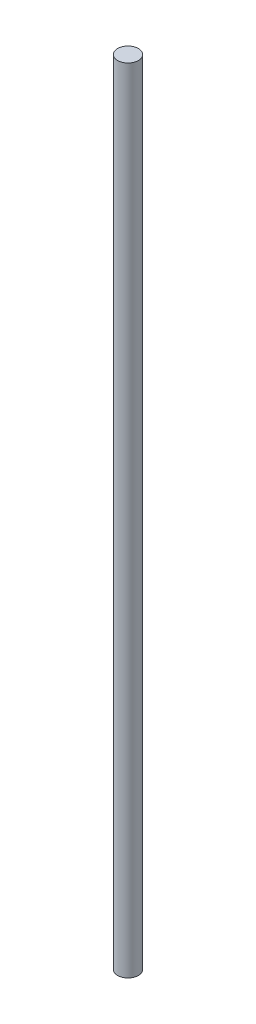
ISO-10303-21;
HEADER;
FILE_DESCRIPTION(('STEP AP214'),'2;1');
FILE_NAME('part.step','',(''),(''),'','','');
FILE_SCHEMA(('AUTOMOTIVE_DESIGN { 1 0 10303 214 1 1 1 1 }'));
ENDSEC;
DATA;
#1=APPLICATION_CONTEXT('core data for automotive mechanical design processes');
#2=APPLICATION_PROTOCOL_DEFINITION('international standard','automotive_design',2000,#1);
#3=PRODUCT_CONTEXT('',#1,'mechanical');
#4=PRODUCT('Part','Part','',(#3));
#5=PRODUCT_RELATED_PRODUCT_CATEGORY('part','',(#4));
#6=PRODUCT_DEFINITION_FORMATION('','',#4);
#7=PRODUCT_DEFINITION_CONTEXT('part definition',#1,'design');
#8=PRODUCT_DEFINITION('design','',#6,#7);
#9=PRODUCT_DEFINITION_SHAPE('','',#8);
#10=(LENGTH_UNIT() NAMED_UNIT(*) SI_UNIT(.MILLI.,.METRE.));
#11=(NAMED_UNIT(*) PLANE_ANGLE_UNIT() SI_UNIT($,.RADIAN.));
#12=(NAMED_UNIT(*) SI_UNIT($,.STERADIAN.) SOLID_ANGLE_UNIT());
#13=UNCERTAINTY_MEASURE_WITH_UNIT(LENGTH_MEASURE(1.E-05),#10,'distance_accuracy_value','');
#14=(GEOMETRIC_REPRESENTATION_CONTEXT(3) GLOBAL_UNCERTAINTY_ASSIGNED_CONTEXT((#13)) GLOBAL_UNIT_ASSIGNED_CONTEXT((#10,
#11,#12)) REPRESENTATION_CONTEXT('',''));
#15=CARTESIAN_POINT('',(0.,0.,0.));
#16=DIRECTION('',(0.,0.,1.));
#17=DIRECTION('',(1.,0.,0.));
#18=AXIS2_PLACEMENT_3D('',#15,#16,#17);
#19=CARTESIAN_POINT('',(0.,380.,0.));
#20=DIRECTION('',(0.,-1.,0.));
#21=DIRECTION('',(0.,0.,-1.));
#22=AXIS2_PLACEMENT_3D('',#19,#20,#21);
#23=CYLINDRICAL_SURFACE('',#22,5.);
#24=CARTESIAN_POINT('',(0.,380.,0.));
#25=DIRECTION('',(0.,1.,0.));
#26=DIRECTION('',(0.,0.,1.));
#27=AXIS2_PLACEMENT_3D('',#24,#25,#26);
#28=CIRCLE('',#27,5.);
#29=CARTESIAN_POINT('',(0.,380.,5.));
#30=VERTEX_POINT('',#29);
#31=EDGE_CURVE('E10',#30,#30,#28,.T.);
#32=ORIENTED_EDGE('',*,*,#31,.F.);
#33=EDGE_LOOP('',(#32));
#34=FACE_BOUND('',#33,.T.);
#35=CARTESIAN_POINT('',(0.,0.,0.));
#36=DIRECTION('',(0.,1.,0.));
#37=DIRECTION('',(0.,0.,1.));
#38=AXIS2_PLACEMENT_3D('',#35,#36,#37);
#39=CIRCLE('',#38,5.);
#40=CARTESIAN_POINT('',(0.,0.,5.));
#41=VERTEX_POINT('',#40);
#42=EDGE_CURVE('E34',#41,#41,#39,.T.);
#43=ORIENTED_EDGE('',*,*,#42,.T.);
#44=EDGE_LOOP('',(#43));
#45=FACE_BOUND('',#44,.T.);
#46=ADVANCED_FACE('F31',(#34,#45),#23,.T.);
#47=CARTESIAN_POINT('',(0.,380.,0.));
#48=DIRECTION('',(0.,1.,0.));
#49=DIRECTION('',(0.,0.,1.));
#50=AXIS2_PLACEMENT_3D('',#47,#48,#49);
#51=PLANE('',#50);
#52=ORIENTED_EDGE('',*,*,#31,.T.);
#53=EDGE_LOOP('',(#52));
#54=FACE_BOUND('',#53,.T.);
#55=ADVANCED_FACE('F46',(#54),#51,.T.);
#56=CARTESIAN_POINT('',(0.,0.,0.));
#57=DIRECTION('',(0.,1.,0.));
#58=DIRECTION('',(0.,0.,1.));
#59=AXIS2_PLACEMENT_3D('',#56,#57,#58);
#60=PLANE('',#59);
#61=ORIENTED_EDGE('',*,*,#42,.F.);
#62=EDGE_LOOP('',(#61));
#63=FACE_BOUND('',#62,.T.);
#64=ADVANCED_FACE('F44',(#63),#60,.F.);
#65=CLOSED_SHELL('',(#46,#55,#64));
#66=MANIFOLD_SOLID_BREP('B2',#65);
#67=ADVANCED_BREP_SHAPE_REPRESENTATION('',(#18,#66),#14);
#68=SHAPE_DEFINITION_REPRESENTATION(#9,#67);
ENDSEC;
END-ISO-10303-21;
